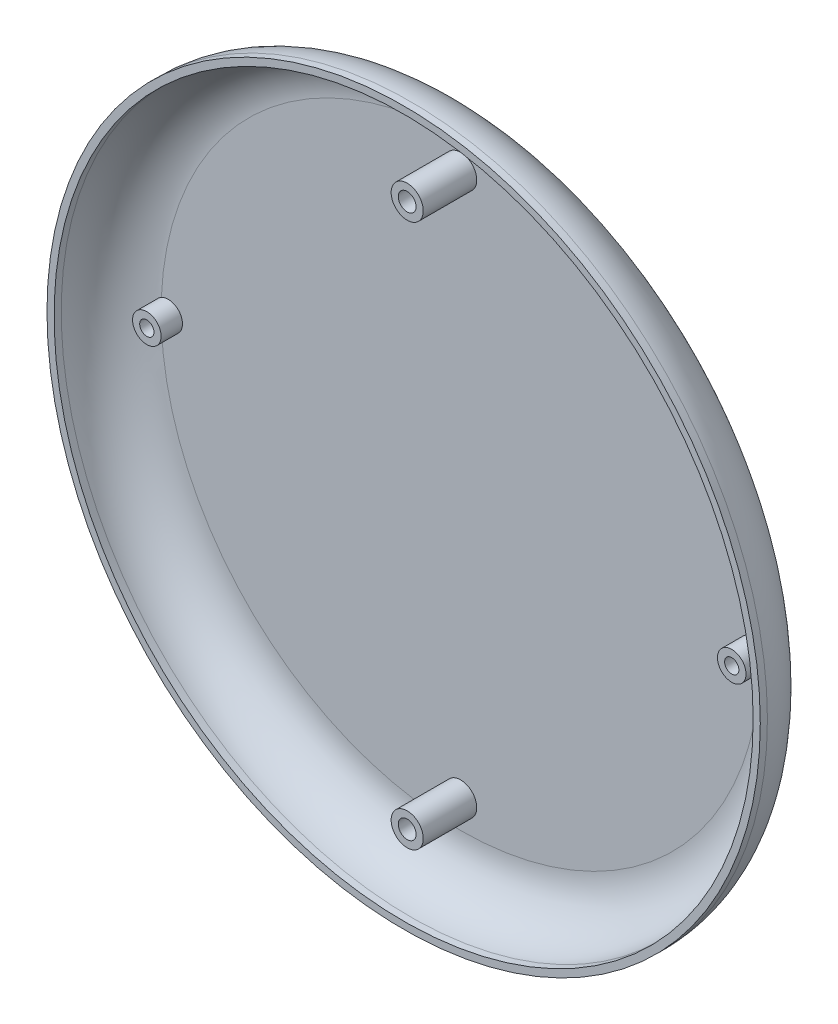
ISO-10303-21;
HEADER;
FILE_DESCRIPTION(('STEP AP214'),'2;1');
FILE_NAME('part.step','',(''),(''),'','','');
FILE_SCHEMA(('AUTOMOTIVE_DESIGN { 1 0 10303 214 1 1 1 1 }'));
ENDSEC;
DATA;
#1=APPLICATION_CONTEXT('core data for automotive mechanical design processes');
#2=APPLICATION_PROTOCOL_DEFINITION('international standard','automotive_design',2000,#1);
#3=PRODUCT_CONTEXT('',#1,'mechanical');
#4=PRODUCT('Part','Part','',(#3));
#5=PRODUCT_RELATED_PRODUCT_CATEGORY('part','',(#4));
#6=PRODUCT_DEFINITION_FORMATION('','',#4);
#7=PRODUCT_DEFINITION_CONTEXT('part definition',#1,'design');
#8=PRODUCT_DEFINITION('design','',#6,#7);
#9=PRODUCT_DEFINITION_SHAPE('','',#8);
#10=(LENGTH_UNIT() NAMED_UNIT(*) SI_UNIT(.MILLI.,.METRE.));
#11=(NAMED_UNIT(*) PLANE_ANGLE_UNIT() SI_UNIT($,.RADIAN.));
#12=(NAMED_UNIT(*) SI_UNIT($,.STERADIAN.) SOLID_ANGLE_UNIT());
#13=UNCERTAINTY_MEASURE_WITH_UNIT(LENGTH_MEASURE(1.E-05),#10,'distance_accuracy_value','');
#14=(GEOMETRIC_REPRESENTATION_CONTEXT(3) GLOBAL_UNCERTAINTY_ASSIGNED_CONTEXT((#13)) GLOBAL_UNIT_ASSIGNED_CONTEXT((#10,
#11,#12)) REPRESENTATION_CONTEXT('',''));
#15=CARTESIAN_POINT('',(0.,0.,0.));
#16=DIRECTION('',(0.,0.,1.));
#17=DIRECTION('',(1.,0.,0.));
#18=AXIS2_PLACEMENT_3D('',#15,#16,#17);
#19=CARTESIAN_POINT('',(0.,0.,1.));
#20=DIRECTION('',(0.,0.,1.));
#21=DIRECTION('',(1.,0.,0.));
#22=AXIS2_PLACEMENT_3D('',#19,#20,#21);
#23=PLANE('',#22);
#24=CARTESIAN_POINT('',(0.,-38.09697969257,1.));
#25=DIRECTION('',(0.,0.,1.));
#26=DIRECTION('',(1.,0.,0.));
#27=AXIS2_PLACEMENT_3D('',#24,#25,#26);
#28=CIRCLE('',#27,1.25);
#29=CARTESIAN_POINT('',(1.25,-38.09697969257,1.));
#30=VERTEX_POINT('',#29);
#31=EDGE_CURVE('E356',#30,#30,#28,.T.);
#32=ORIENTED_EDGE('',*,*,#31,.T.);
#33=EDGE_LOOP('',(#32));
#34=FACE_BOUND('',#33,.T.);
#35=ADVANCED_FACE('F17',(#34),#23,.T.);
#36=CARTESIAN_POINT('',(0.,0.,1.));
#37=DIRECTION('',(0.,0.,1.));
#38=DIRECTION('',(1.,0.,0.));
#39=AXIS2_PLACEMENT_3D('',#36,#37,#38);
#40=PLANE('',#39);
#41=CARTESIAN_POINT('',(0.,38.09697969257,1.));
#42=DIRECTION('',(0.,0.,1.));
#43=DIRECTION('',(1.,0.,0.));
#44=AXIS2_PLACEMENT_3D('',#41,#42,#43);
#45=CIRCLE('',#44,1.25);
#46=CARTESIAN_POINT('',(1.25,38.09697969257,1.));
#47=VERTEX_POINT('',#46);
#48=EDGE_CURVE('E358',#47,#47,#45,.T.);
#49=ORIENTED_EDGE('',*,*,#48,.T.);
#50=EDGE_LOOP('',(#49));
#51=FACE_BOUND('',#50,.T.);
#52=ADVANCED_FACE('F331',(#51),#40,.T.);
#53=CARTESIAN_POINT('',(0.,0.,1.));
#54=DIRECTION('',(0.,0.,1.));
#55=DIRECTION('',(1.,0.,0.));
#56=AXIS2_PLACEMENT_3D('',#53,#54,#55);
#57=PLANE('',#56);
#58=CARTESIAN_POINT('',(41.,0.,1.));
#59=DIRECTION('',(0.,0.,1.));
#60=DIRECTION('',(1.,0.,0.));
#61=AXIS2_PLACEMENT_3D('',#58,#59,#60);
#62=CIRCLE('',#61,1.);
#63=CARTESIAN_POINT('',(42.,0.,1.));
#64=VERTEX_POINT('',#63);
#65=EDGE_CURVE('E361',#64,#64,#62,.T.);
#66=ORIENTED_EDGE('',*,*,#65,.T.);
#67=EDGE_LOOP('',(#66));
#68=FACE_BOUND('',#67,.T.);
#69=ADVANCED_FACE('F294',(#68),#57,.T.);
#70=CARTESIAN_POINT('',(0.,-38.09697969257,8.5));
#71=DIRECTION('',(0.,0.,1.));
#72=DIRECTION('',(1.,0.,0.));
#73=AXIS2_PLACEMENT_3D('',#70,#71,#72);
#74=CYLINDRICAL_SURFACE('',#73,1.25);
#75=CARTESIAN_POINT('',(0.,-38.09697969257,8.5));
#76=DIRECTION('',(0.,0.,1.));
#77=DIRECTION('',(1.,0.,0.));
#78=AXIS2_PLACEMENT_3D('',#75,#76,#77);
#79=CIRCLE('',#78,1.25);
#80=CARTESIAN_POINT('',(1.25,-38.09697969257,8.5));
#81=VERTEX_POINT('',#80);
#82=EDGE_CURVE('E375',#81,#81,#79,.F.);
#83=ORIENTED_EDGE('',*,*,#82,.F.);
#84=EDGE_LOOP('',(#83));
#85=FACE_BOUND('',#84,.T.);
#86=ORIENTED_EDGE('',*,*,#31,.F.);
#87=EDGE_LOOP('',(#86));
#88=FACE_BOUND('',#87,.T.);
#89=ADVANCED_FACE('F284',(#85,#88),#74,.F.);
#90=CARTESIAN_POINT('',(0.,38.09697969257,8.5));
#91=DIRECTION('',(0.,0.,1.));
#92=DIRECTION('',(1.,0.,0.));
#93=AXIS2_PLACEMENT_3D('',#90,#91,#92);
#94=CYLINDRICAL_SURFACE('',#93,1.25);
#95=CARTESIAN_POINT('',(0.,38.09697969257,8.5));
#96=DIRECTION('',(0.,0.,1.));
#97=DIRECTION('',(1.,0.,0.));
#98=AXIS2_PLACEMENT_3D('',#95,#96,#97);
#99=CIRCLE('',#98,1.25);
#100=CARTESIAN_POINT('',(1.25,38.09697969257,8.5));
#101=VERTEX_POINT('',#100);
#102=EDGE_CURVE('E378',#101,#101,#99,.F.);
#103=ORIENTED_EDGE('',*,*,#102,.F.);
#104=EDGE_LOOP('',(#103));
#105=FACE_BOUND('',#104,.T.);
#106=ORIENTED_EDGE('',*,*,#48,.F.);
#107=EDGE_LOOP('',(#106));
#108=FACE_BOUND('',#107,.T.);
#109=ADVANCED_FACE('F278',(#105,#108),#94,.F.);
#110=CARTESIAN_POINT('',(0.,0.,1.));
#111=DIRECTION('',(0.,0.,1.));
#112=DIRECTION('',(1.,0.,0.));
#113=AXIS2_PLACEMENT_3D('',#110,#111,#112);
#114=PLANE('',#113);
#115=CARTESIAN_POINT('',(-41.,0.,1.));
#116=DIRECTION('',(0.,0.,1.));
#117=DIRECTION('',(1.,0.,0.));
#118=AXIS2_PLACEMENT_3D('',#115,#116,#117);
#119=CIRCLE('',#118,1.);
#120=CARTESIAN_POINT('',(-40.,0.,1.));
#121=VERTEX_POINT('',#120);
#122=EDGE_CURVE('E381',#121,#121,#119,.T.);
#123=ORIENTED_EDGE('',*,*,#122,.T.);
#124=EDGE_LOOP('',(#123));
#125=FACE_BOUND('',#124,.T.);
#126=ADVANCED_FACE('F268',(#125),#114,.T.);
#127=CARTESIAN_POINT('',(41.,0.,4.));
#128=DIRECTION('',(0.,0.,1.));
#129=DIRECTION('',(1.,0.,0.));
#130=AXIS2_PLACEMENT_3D('',#127,#128,#129);
#131=CYLINDRICAL_SURFACE('',#130,1.);
#132=CARTESIAN_POINT('',(41.,0.,4.));
#133=DIRECTION('',(0.,0.,1.));
#134=DIRECTION('',(1.,0.,0.));
#135=AXIS2_PLACEMENT_3D('',#132,#133,#134);
#136=CIRCLE('',#135,1.);
#137=CARTESIAN_POINT('',(42.,0.,4.));
#138=VERTEX_POINT('',#137);
#139=EDGE_CURVE('E384',#138,#138,#136,.F.);
#140=ORIENTED_EDGE('',*,*,#139,.F.);
#141=EDGE_LOOP('',(#140));
#142=FACE_BOUND('',#141,.T.);
#143=ORIENTED_EDGE('',*,*,#65,.F.);
#144=EDGE_LOOP('',(#143));
#145=FACE_BOUND('',#144,.T.);
#146=ADVANCED_FACE('F261',(#142,#145),#131,.F.);
#147=CARTESIAN_POINT('',(0.,0.,8.5));
#148=DIRECTION('',(0.,0.,1.));
#149=DIRECTION('',(1.,0.,0.));
#150=AXIS2_PLACEMENT_3D('',#147,#148,#149);
#151=PLANE('',#150);
#152=ORIENTED_EDGE('',*,*,#82,.T.);
#153=EDGE_LOOP('',(#152));
#154=FACE_BOUND('',#153,.T.);
#155=CARTESIAN_POINT('',(0.,-38.09697969257,8.5));
#156=DIRECTION('',(0.,0.,1.));
#157=DIRECTION('',(1.,0.,0.));
#158=AXIS2_PLACEMENT_3D('',#155,#156,#157);
#159=CIRCLE('',#158,2.25);
#160=CARTESIAN_POINT('',(2.25,-38.09697969257,8.5));
#161=VERTEX_POINT('',#160);
#162=EDGE_CURVE('E387',#161,#161,#159,.F.);
#163=ORIENTED_EDGE('',*,*,#162,.F.);
#164=EDGE_LOOP('',(#163));
#165=FACE_BOUND('',#164,.T.);
#166=ADVANCED_FACE('F267',(#154,#165),#151,.T.);
#167=CARTESIAN_POINT('',(0.,0.,8.5));
#168=DIRECTION('',(0.,0.,1.));
#169=DIRECTION('',(1.,0.,0.));
#170=AXIS2_PLACEMENT_3D('',#167,#168,#169);
#171=PLANE('',#170);
#172=ORIENTED_EDGE('',*,*,#102,.T.);
#173=EDGE_LOOP('',(#172));
#174=FACE_BOUND('',#173,.T.);
#175=CARTESIAN_POINT('',(0.,38.09697969257,8.5));
#176=DIRECTION('',(0.,0.,1.));
#177=DIRECTION('',(1.,0.,0.));
#178=AXIS2_PLACEMENT_3D('',#175,#176,#177);
#179=CIRCLE('',#178,2.25);
#180=CARTESIAN_POINT('',(2.25,38.09697969257,8.5));
#181=VERTEX_POINT('',#180);
#182=EDGE_CURVE('E390',#181,#181,#179,.F.);
#183=ORIENTED_EDGE('',*,*,#182,.F.);
#184=EDGE_LOOP('',(#183));
#185=FACE_BOUND('',#184,.T.);
#186=ADVANCED_FACE('F251',(#174,#185),#171,.T.);
#187=CARTESIAN_POINT('',(-41.,0.,4.));
#188=DIRECTION('',(0.,0.,1.));
#189=DIRECTION('',(1.,0.,0.));
#190=AXIS2_PLACEMENT_3D('',#187,#188,#189);
#191=CYLINDRICAL_SURFACE('',#190,1.);
#192=CARTESIAN_POINT('',(-41.,0.,4.));
#193=DIRECTION('',(0.,0.,1.));
#194=DIRECTION('',(1.,0.,0.));
#195=AXIS2_PLACEMENT_3D('',#192,#193,#194);
#196=CIRCLE('',#195,1.);
#197=CARTESIAN_POINT('',(-40.,0.,4.));
#198=VERTEX_POINT('',#197);
#199=EDGE_CURVE('E393',#198,#198,#196,.F.);
#200=ORIENTED_EDGE('',*,*,#199,.F.);
#201=EDGE_LOOP('',(#200));
#202=FACE_BOUND('',#201,.T.);
#203=ORIENTED_EDGE('',*,*,#122,.F.);
#204=EDGE_LOOP('',(#203));
#205=FACE_BOUND('',#204,.T.);
#206=ADVANCED_FACE('F244',(#202,#205),#191,.F.);
#207=CARTESIAN_POINT('',(0.,0.,4.));
#208=DIRECTION('',(0.,0.,1.));
#209=DIRECTION('',(1.,0.,0.));
#210=AXIS2_PLACEMENT_3D('',#207,#208,#209);
#211=PLANE('',#210);
#212=ORIENTED_EDGE('',*,*,#139,.T.);
#213=EDGE_LOOP('',(#212));
#214=FACE_BOUND('',#213,.T.);
#215=CARTESIAN_POINT('',(41.,0.,4.));
#216=DIRECTION('',(0.,0.,1.));
#217=DIRECTION('',(1.,0.,0.));
#218=AXIS2_PLACEMENT_3D('',#215,#216,#217);
#219=CIRCLE('',#218,2.);
#220=CARTESIAN_POINT('',(43.,0.,4.));
#221=VERTEX_POINT('',#220);
#222=EDGE_CURVE('E63',#221,#221,#219,.F.);
#223=ORIENTED_EDGE('',*,*,#222,.F.);
#224=EDGE_LOOP('',(#223));
#225=FACE_BOUND('',#224,.T.);
#226=ADVANCED_FACE('F250',(#214,#225),#211,.T.);
#227=CARTESIAN_POINT('',(0.,-38.09697969257,8.5));
#228=DIRECTION('',(0.,0.,1.));
#229=DIRECTION('',(1.,0.,0.));
#230=AXIS2_PLACEMENT_3D('',#227,#228,#229);
#231=CYLINDRICAL_SURFACE('',#230,2.25);
#232=ORIENTED_EDGE('',*,*,#162,.T.);
#233=EDGE_LOOP('',(#232));
#234=FACE_BOUND('',#233,.T.);
#235=CARTESIAN_POINT('',(0.,-38.09697969257,1.));
#236=DIRECTION('',(0.,0.,1.));
#237=DIRECTION('',(1.,0.,0.));
#238=AXIS2_PLACEMENT_3D('',#235,#236,#237);
#239=CIRCLE('',#238,2.25);
#240=CARTESIAN_POINT('',(2.25,-38.09697969257,1.));
#241=VERTEX_POINT('',#240);
#242=EDGE_CURVE('E62',#241,#241,#239,.F.);
#243=ORIENTED_EDGE('',*,*,#242,.F.);
#244=EDGE_LOOP('',(#243));
#245=FACE_BOUND('',#244,.T.);
#246=ADVANCED_FACE('F415',(#234,#245),#231,.T.);
#247=CARTESIAN_POINT('',(0.,38.09697969257,8.5));
#248=DIRECTION('',(0.,0.,1.));
#249=DIRECTION('',(1.,0.,0.));
#250=AXIS2_PLACEMENT_3D('',#247,#248,#249);
#251=CYLINDRICAL_SURFACE('',#250,2.25);
#252=ORIENTED_EDGE('',*,*,#182,.T.);
#253=EDGE_LOOP('',(#252));
#254=FACE_BOUND('',#253,.T.);
#255=CARTESIAN_POINT('',(0.,38.09697969257,1.));
#256=DIRECTION('',(0.,0.,1.));
#257=DIRECTION('',(1.,0.,0.));
#258=AXIS2_PLACEMENT_3D('',#255,#256,#257);
#259=CIRCLE('',#258,2.25);
#260=CARTESIAN_POINT('',(2.25,38.09697969257,1.));
#261=VERTEX_POINT('',#260);
#262=EDGE_CURVE('E402',#261,#261,#259,.F.);
#263=ORIENTED_EDGE('',*,*,#262,.F.);
#264=EDGE_LOOP('',(#263));
#265=FACE_BOUND('',#264,.T.);
#266=ADVANCED_FACE('F410',(#254,#265),#251,.T.);
#267=CARTESIAN_POINT('',(0.,0.,4.));
#268=DIRECTION('',(0.,0.,1.));
#269=DIRECTION('',(1.,0.,0.));
#270=AXIS2_PLACEMENT_3D('',#267,#268,#269);
#271=PLANE('',#270);
#272=ORIENTED_EDGE('',*,*,#199,.T.);
#273=EDGE_LOOP('',(#272));
#274=FACE_BOUND('',#273,.T.);
#275=CARTESIAN_POINT('',(-41.,0.,4.));
#276=DIRECTION('',(0.,0.,1.));
#277=DIRECTION('',(1.,0.,0.));
#278=AXIS2_PLACEMENT_3D('',#275,#276,#277);
#279=CIRCLE('',#278,2.);
#280=CARTESIAN_POINT('',(-39.,0.,4.));
#281=VERTEX_POINT('',#280);
#282=EDGE_CURVE('E404',#281,#281,#279,.F.);
#283=ORIENTED_EDGE('',*,*,#282,.F.);
#284=EDGE_LOOP('',(#283));
#285=FACE_BOUND('',#284,.T.);
#286=ADVANCED_FACE('F133',(#274,#285),#271,.T.);
#287=CARTESIAN_POINT('',(41.,0.,4.));
#288=DIRECTION('',(0.,0.,1.));
#289=DIRECTION('',(1.,0.,0.));
#290=AXIS2_PLACEMENT_3D('',#287,#288,#289);
#291=CYLINDRICAL_SURFACE('',#290,2.);
#292=ORIENTED_EDGE('',*,*,#222,.T.);
#293=EDGE_LOOP('',(#292));
#294=FACE_BOUND('',#293,.T.);
#295=CARTESIAN_POINT('',(41.963414634149,-1.75266432687712,0.999999999999998));
#296=CARTESIAN_POINT('',(42.0125407955933,-1.72566053780181,0.999998605608498));
#297=CARTESIAN_POINT('',(42.0605049485383,-1.69660399490661,1.00049304666651));
#298=CARTESIAN_POINT('',(42.1538095762638,-1.6345836588381,1.00231069753761));
#299=CARTESIAN_POINT('',(42.1991504709918,-1.60162049365104,1.0036337742943));
#300=CARTESIAN_POINT('',(42.3306007427351,-1.49732200696922,1.00859398563942));
#301=CARTESIAN_POINT('',(42.4123770188485,-1.42044576862906,1.01322366986374));
#302=CARTESIAN_POINT('',(42.5618685729098,-1.25422489466937,1.02371526176465));
#303=CARTESIAN_POINT('',(42.6295848490365,-1.16488114492457,1.0295770819072));
#304=CARTESIAN_POINT('',(42.7492232054637,-0.97606633702642,1.04116748835521));
#305=CARTESIAN_POINT('',(42.8011348607872,-0.876588651847311,1.04689598442754));
#306=CARTESIAN_POINT('',(42.8879903290452,-0.669489081548885,1.05707773522346));
#307=CARTESIAN_POINT('',(42.9227933980793,-0.561807792394337,1.06152029244609));
#308=CARTESIAN_POINT('',(42.973705425301,-0.342237089599602,1.06817960311079));
#309=CARTESIAN_POINT('',(42.9898611089214,-0.230358922518536,1.07040191800624));
#310=CARTESIAN_POINT('',(42.9988402022274,-0.078758357580138,1.07163805221539));
#311=CARTESIAN_POINT('',(43.0000033775399,-0.0393895395536701,1.07179840581315));
#312=CARTESIAN_POINT('',(42.9999904148594,0.111783810045855,1.07179212665868));
#313=CARTESIAN_POINT('',(42.990585750885,0.223734505068865,1.07048286557135));
#314=CARTESIAN_POINT('',(42.9531817222907,0.444620438402502,1.06547521031159));
#315=CARTESIAN_POINT('',(42.9251366039947,0.553547568205071,1.06177093810783));
#316=CARTESIAN_POINT('',(42.8513063259348,0.764966313278984,1.05269177223111));
#317=CARTESIAN_POINT('',(42.8055487240646,0.867467639660252,1.047319476303));
#318=CARTESIAN_POINT('',(42.6975796902708,1.06335894826144,1.03597836251269));
#319=CARTESIAN_POINT('',(42.6353685378316,1.15674908520949,1.03000955478408));
#320=CARTESIAN_POINT('',(42.4957190576987,1.33248598281684,1.01875364513302));
#321=CARTESIAN_POINT('',(42.4181750977715,1.41474906224923,1.01347171924775));
#322=CARTESIAN_POINT('',(42.2503939668515,1.56497228871074,1.00510558461628));
#323=CARTESIAN_POINT('',(42.160184291498,1.63296264269859,1.00201670077753));
#324=CARTESIAN_POINT('',(42.0317258673051,1.7137986797298,1.00024080900158));
#325=CARTESIAN_POINT('',(41.9978435546459,1.73374849844185,0.999997473415696));
#326=CARTESIAN_POINT('',(41.963414634149,1.75266432687714,0.999999999999998));
#327=B_SPLINE_CURVE_WITH_KNOTS('',3,(#295,#296,#297,#298,#299,#300,#301,#302,#303,#304,#305,
#306,#307,#308,#309,#310,#311,#312,#313,#314,#315,#316,#317,#318,#319,#320,#321,#322,#323,#324,
#325,#326),.UNSPECIFIED.,.F.,.F.,(4,2,2,2,2,2,2,2,2,2,2,2,2,2,2,4),(0.,0.168067518277013,
0.336108056392385,0.671379915003548,1.00662796310704,1.34209666938312,1.68028075929185,
2.01761559667121,2.13574584937279,2.47098840085391,2.80705687127481,3.14260455902755,
3.4781465474467,3.81608621761569,4.15330329241182,4.27118761797201),.UNSPECIFIED.);
#328=CARTESIAN_POINT('',(41.9634146341497,-1.75266432687838,0.999999999999999));
#329=VERTEX_POINT('',#328);
#330=CARTESIAN_POINT('',(41.9634146341497,1.75266432687837,0.999999999999999));
#331=VERTEX_POINT('',#330);
#332=EDGE_CURVE('E69',#329,#331,#327,.T.);
#333=ORIENTED_EDGE('',*,*,#332,.T.);
#334=CARTESIAN_POINT('',(41.,0.,1.));
#335=DIRECTION('',(0.,0.,1.));
#336=DIRECTION('',(1.,0.,0.));
#337=AXIS2_PLACEMENT_3D('',#334,#335,#336);
#338=CIRCLE('',#337,2.);
#339=EDGE_CURVE('E52',#329,#331,#338,.F.);
#340=ORIENTED_EDGE('',*,*,#339,.F.);
#341=EDGE_LOOP('',(#333,#340));
#342=FACE_BOUND('',#341,.T.);
#343=ADVANCED_FACE('F73',(#294,#342),#291,.T.);
#344=CARTESIAN_POINT('',(0.,0.,1.));
#345=DIRECTION('',(0.,0.,1.));
#346=DIRECTION('',(1.,0.,0.));
#347=AXIS2_PLACEMENT_3D('',#344,#345,#346);
#348=PLANE('',#347);
#349=ORIENTED_EDGE('',*,*,#262,.T.);
#350=EDGE_LOOP('',(#349));
#351=FACE_BOUND('',#350,.T.);
#352=ORIENTED_EDGE('',*,*,#242,.T.);
#353=EDGE_LOOP('',(#352));
#354=FACE_BOUND('',#353,.T.);
#355=CARTESIAN_POINT('',(0.,0.,0.999999999999998));
#356=DIRECTION('',(0.,0.,-1.));
#357=DIRECTION('',(0.999128919860627,-0.0417301030209251,0.));
#358=AXIS2_PLACEMENT_3D('',#355,#356,#357);
#359=CIRCLE('',#358,42.0000000000037);
#360=CARTESIAN_POINT('',(-41.9634146341497,-1.75266432687836,0.999999999999999));
#361=VERTEX_POINT('',#360);
#362=EDGE_CURVE('E58',#361,#329,#359,.F.);
#363=ORIENTED_EDGE('',*,*,#362,.T.);
#364=ORIENTED_EDGE('',*,*,#339,.T.);
#365=CARTESIAN_POINT('',(0.,0.,0.999999999999998));
#366=DIRECTION('',(0.,0.,-1.));
#367=DIRECTION('',(-0.999128919860627,0.0417301030209248,0.));
#368=AXIS2_PLACEMENT_3D('',#365,#366,#367);
#369=CIRCLE('',#368,42.0000000000037);
#370=CARTESIAN_POINT('',(-41.9634146341497,1.75266432687837,0.999999999999999));
#371=VERTEX_POINT('',#370);
#372=EDGE_CURVE('E55',#331,#371,#369,.F.);
#373=ORIENTED_EDGE('',*,*,#372,.T.);
#374=CARTESIAN_POINT('',(-41.,0.,1.));
#375=DIRECTION('',(0.,0.,1.));
#376=DIRECTION('',(1.,0.,0.));
#377=AXIS2_PLACEMENT_3D('',#374,#375,#376);
#378=CIRCLE('',#377,2.);
#379=EDGE_CURVE('E48',#361,#371,#378,.T.);
#380=ORIENTED_EDGE('',*,*,#379,.F.);
#381=EDGE_LOOP('',(#363,#364,#373,#380));
#382=FACE_BOUND('',#381,.T.);
#383=ADVANCED_FACE('F54',(#351,#354,#382),#348,.T.);
#384=CARTESIAN_POINT('',(-41.,0.,4.));
#385=DIRECTION('',(0.,0.,1.));
#386=DIRECTION('',(1.,0.,0.));
#387=AXIS2_PLACEMENT_3D('',#384,#385,#386);
#388=CYLINDRICAL_SURFACE('',#387,2.);
#389=ORIENTED_EDGE('',*,*,#282,.T.);
#390=EDGE_LOOP('',(#389));
#391=FACE_BOUND('',#390,.T.);
#392=CARTESIAN_POINT('',(-41.963414634149,1.75266432687712,0.999999999999998));
#393=CARTESIAN_POINT('',(-42.0125407955933,1.72566053780181,0.999998605608499));
#394=CARTESIAN_POINT('',(-42.0605049485383,1.69660399490663,1.00049304666651));
#395=CARTESIAN_POINT('',(-42.1538095762638,1.63458365883811,1.00231069753761));
#396=CARTESIAN_POINT('',(-42.1991504709918,1.60162049365105,1.0036337742943));
#397=CARTESIAN_POINT('',(-42.3306007427351,1.49732200696922,1.00859398563942));
#398=CARTESIAN_POINT('',(-42.4123770188485,1.42044576862906,1.01322366986374));
#399=CARTESIAN_POINT('',(-42.5618685729098,1.25422489466937,1.02371526176465));
#400=CARTESIAN_POINT('',(-42.6295848490365,1.16488114492458,1.0295770819072));
#401=CARTESIAN_POINT('',(-42.7492232054637,0.976066337026435,1.04116748835521));
#402=CARTESIAN_POINT('',(-42.8011348607872,0.87658865184732,1.04689598442754));
#403=CARTESIAN_POINT('',(-42.8879903290452,0.669489081548889,1.05707773522346));
#404=CARTESIAN_POINT('',(-42.9227933980793,0.561807792394341,1.06152029244609));
#405=CARTESIAN_POINT('',(-42.973705425301,0.34223708959961,1.06817960311079));
#406=CARTESIAN_POINT('',(-42.9898611089214,0.23035892251855,1.07040191800624));
#407=CARTESIAN_POINT('',(-42.9988402022267,0.0787583575928798,1.07163805221529));
#408=CARTESIAN_POINT('',(-43.0000033775391,0.0393895395791456,1.07179840581305));
#409=CARTESIAN_POINT('',(-42.9999904148615,-0.111783810007581,1.07179212665897));
#410=CARTESIAN_POINT('',(-42.9905857508893,-0.22373450503072,1.07048286557194));
#411=CARTESIAN_POINT('',(-42.9531817222992,-0.444620438364989,1.06547521031271));
#412=CARTESIAN_POINT('',(-42.9251366040053,-0.553547568168062,1.0617709381092));
#413=CARTESIAN_POINT('',(-42.8513063259496,-0.764966313243316,1.05269177223287));
#414=CARTESIAN_POINT('',(-42.8055487240813,-0.867467639625422,1.04731947630489));
#415=CARTESIAN_POINT('',(-42.6975796902914,-1.06335894822861,1.03597836251472));
#416=CARTESIAN_POINT('',(-42.635368537854,-1.15674908517783,1.03000955478611));
#417=CARTESIAN_POINT('',(-42.4957190577246,-1.33248598278779,1.01875364513488));
#418=CARTESIAN_POINT('',(-42.418175097799,-1.41474906222165,1.01347171924944));
#419=CARTESIAN_POINT('',(-42.250393966882,-1.56497228868634,1.00510558461748));
#420=CARTESIAN_POINT('',(-42.1601842915298,-1.63296264267592,1.0020167007784));
#421=CARTESIAN_POINT('',(-42.0317258673276,-1.71379867971658,1.00024080900174));
#422=CARTESIAN_POINT('',(-41.9978435546573,-1.73374849843557,0.999997473415694));
#423=CARTESIAN_POINT('',(-41.963414634149,-1.75266432687712,0.999999999999998));
#424=B_SPLINE_CURVE_WITH_KNOTS('',3,(#392,#393,#394,#395,#396,#397,#398,#399,#400,#401,#402,
#403,#404,#405,#406,#407,#408,#409,#410,#411,#412,#413,#414,#415,#416,#417,#418,#419,#420,#421,
#422,#423),.UNSPECIFIED.,.F.,.F.,(4,2,2,2,2,2,2,2,2,2,2,2,2,2,2,4),(0.,0.168067518277006,
0.336108056392385,0.671379915003547,1.00662796310703,1.34209666938312,1.68028075929186,
2.01761559667117,2.13574584933462,2.47098840081555,2.80705687123631,3.14260455898891,
3.47814654740787,3.81608621757672,4.15330329237281,4.27118761797201),.UNSPECIFIED.);
#425=EDGE_CURVE('E70',#371,#361,#424,.T.);
#426=ORIENTED_EDGE('',*,*,#425,.T.);
#427=ORIENTED_EDGE('',*,*,#379,.T.);
#428=EDGE_LOOP('',(#426,#427));
#429=FACE_BOUND('',#428,.T.);
#430=ADVANCED_FACE('F98',(#391,#429),#388,.T.);
#431=CARTESIAN_POINT('',(0.,0.,8.));
#432=DIRECTION('',(0.,0.,1.));
#433=DIRECTION('',(-0.999997614286644,-0.0021843582629141,0.));
#434=AXIS2_PLACEMENT_3D('',#431,#432,#433);
#435=TOROIDAL_SURFACE('',#434,42.,7.);
#436=CARTESIAN_POINT('',(0.,0.,8.));
#437=DIRECTION('',(0.,0.,1.));
#438=DIRECTION('',(1.,0.,0.));
#439=AXIS2_PLACEMENT_3D('',#436,#437,#438);
#440=CIRCLE('',#439,49.);
#441=CARTESIAN_POINT('',(49.,0.,8.));
#442=VERTEX_POINT('',#441);
#443=EDGE_CURVE('E106',#442,#442,#440,.T.);
#444=ORIENTED_EDGE('',*,*,#443,.T.);
#445=EDGE_LOOP('',(#444));
#446=FACE_BOUND('',#445,.T.);
#447=ORIENTED_EDGE('',*,*,#362,.F.);
#448=ORIENTED_EDGE('',*,*,#425,.F.);
#449=ORIENTED_EDGE('',*,*,#372,.F.);
#450=ORIENTED_EDGE('',*,*,#332,.F.);
#451=EDGE_LOOP('',(#447,#448,#449,#450));
#452=FACE_BOUND('',#451,.T.);
#453=ADVANCED_FACE('F68',(#446,#452),#435,.F.);
#454=CARTESIAN_POINT('',(0.,0.,0.));
#455=DIRECTION('',(0.,0.,1.));
#456=DIRECTION('',(1.,0.,0.));
#457=AXIS2_PLACEMENT_3D('',#454,#455,#456);
#458=CYLINDRICAL_SURFACE('',#457,49.);
#459=ORIENTED_EDGE('',*,*,#443,.F.);
#460=EDGE_LOOP('',(#459));
#461=FACE_BOUND('',#460,.T.);
#462=CARTESIAN_POINT('',(0.,0.,9.));
#463=DIRECTION('',(0.,0.,1.));
#464=DIRECTION('',(1.,0.,0.));
#465=AXIS2_PLACEMENT_3D('',#462,#463,#464);
#466=CIRCLE('',#465,49.);
#467=CARTESIAN_POINT('',(49.,0.,9.));
#468=VERTEX_POINT('',#467);
#469=EDGE_CURVE('E180',#468,#468,#466,.F.);
#470=ORIENTED_EDGE('',*,*,#469,.F.);
#471=EDGE_LOOP('',(#470));
#472=FACE_BOUND('',#471,.T.);
#473=ADVANCED_FACE('F97',(#461,#472),#458,.F.);
#474=CARTESIAN_POINT('',(-75.,-75.,9.));
#475=DIRECTION('',(0.,0.,1.));
#476=DIRECTION('',(1.,0.,0.));
#477=AXIS2_PLACEMENT_3D('',#474,#475,#476);
#478=PLANE('',#477);
#479=ORIENTED_EDGE('',*,*,#469,.T.);
#480=EDGE_LOOP('',(#479));
#481=FACE_BOUND('',#480,.T.);
#482=CARTESIAN_POINT('',(0.,0.,9.));
#483=DIRECTION('',(0.,0.,1.));
#484=DIRECTION('',(1.,0.,0.));
#485=AXIS2_PLACEMENT_3D('',#482,#483,#484);
#486=CIRCLE('',#485,50.);
#487=CARTESIAN_POINT('',(50.,0.,9.));
#488=VERTEX_POINT('',#487);
#489=EDGE_CURVE('E177',#488,#488,#486,.F.);
#490=ORIENTED_EDGE('',*,*,#489,.F.);
#491=EDGE_LOOP('',(#490));
#492=FACE_BOUND('',#491,.T.);
#493=ADVANCED_FACE('F194',(#481,#492),#478,.T.);
#494=CARTESIAN_POINT('',(0.,0.,0.));
#495=DIRECTION('',(0.,0.,1.));
#496=DIRECTION('',(1.,0.,0.));
#497=AXIS2_PLACEMENT_3D('',#494,#495,#496);
#498=CYLINDRICAL_SURFACE('',#497,50.);
#499=CARTESIAN_POINT('',(0.,0.,8.));
#500=DIRECTION('',(0.,0.,1.));
#501=DIRECTION('',(0.999997614286644,0.0021843582629151,0.));
#502=AXIS2_PLACEMENT_3D('',#499,#500,#501);
#503=CIRCLE('',#502,50.);
#504=CARTESIAN_POINT('',(49.9998807143322,0.109217913145755,8.));
#505=VERTEX_POINT('',#504);
#506=EDGE_CURVE('E170',#505,#505,#503,.F.);
#507=ORIENTED_EDGE('',*,*,#506,.F.);
#508=EDGE_LOOP('',(#507));
#509=FACE_BOUND('',#508,.T.);
#510=ORIENTED_EDGE('',*,*,#489,.T.);
#511=EDGE_LOOP('',(#510));
#512=FACE_BOUND('',#511,.T.);
#513=ADVANCED_FACE('F144',(#509,#512),#498,.T.);
#514=CARTESIAN_POINT('',(0.,0.,8.));
#515=DIRECTION('',(0.,0.,1.));
#516=DIRECTION('',(0.999997614286644,0.0021843582629151,0.));
#517=AXIS2_PLACEMENT_3D('',#514,#515,#516);
#518=TOROIDAL_SURFACE('',#517,42.,8.);
#519=ORIENTED_EDGE('',*,*,#506,.T.);
#520=EDGE_LOOP('',(#519));
#521=FACE_BOUND('',#520,.T.);
#522=CARTESIAN_POINT('',(0.,0.,0.));
#523=DIRECTION('',(0.,0.,1.));
#524=DIRECTION('',(-1.,0.,0.));
#525=AXIS2_PLACEMENT_3D('',#522,#523,#524);
#526=CIRCLE('',#525,42.);
#527=CARTESIAN_POINT('',(-42.,0.,0.));
#528=VERTEX_POINT('',#527);
#529=CARTESIAN_POINT('',(42.,0.,0.));
#530=VERTEX_POINT('',#529);
#531=EDGE_CURVE('E11',#528,#530,#526,.T.);
#532=ORIENTED_EDGE('',*,*,#531,.T.);
#533=CARTESIAN_POINT('',(0.,0.,0.));
#534=DIRECTION('',(0.,0.,1.));
#535=DIRECTION('',(1.,0.,0.));
#536=AXIS2_PLACEMENT_3D('',#533,#534,#535);
#537=CIRCLE('',#536,42.);
#538=EDGE_CURVE('E28',#530,#528,#537,.T.);
#539=ORIENTED_EDGE('',*,*,#538,.T.);
#540=EDGE_LOOP('',(#532,#539));
#541=FACE_BOUND('',#540,.T.);
#542=ADVANCED_FACE('F139',(#521,#541),#518,.T.);
#543=CARTESIAN_POINT('',(0.,0.,0.));
#544=DIRECTION('',(0.,0.,1.));
#545=DIRECTION('',(1.,0.,0.));
#546=AXIS2_PLACEMENT_3D('',#543,#544,#545);
#547=PLANE('',#546);
#548=ORIENTED_EDGE('',*,*,#538,.F.);
#549=ORIENTED_EDGE('',*,*,#531,.F.);
#550=EDGE_LOOP('',(#548,#549));
#551=FACE_BOUND('',#550,.T.);
#552=ADVANCED_FACE('F137',(#551),#547,.F.);
#553=CLOSED_SHELL('',(#35,#52,#69,#89,#109,#126,#146,#166,#186,#206,#226,#246,#266,#286,#343,
#383,#430,#453,#473,#493,#513,#542,#552));
#554=MANIFOLD_SOLID_BREP('B1',#553);
#555=ADVANCED_BREP_SHAPE_REPRESENTATION('',(#18,#554),#14);
#556=SHAPE_DEFINITION_REPRESENTATION(#9,#555);
ENDSEC;
END-ISO-10303-21;
